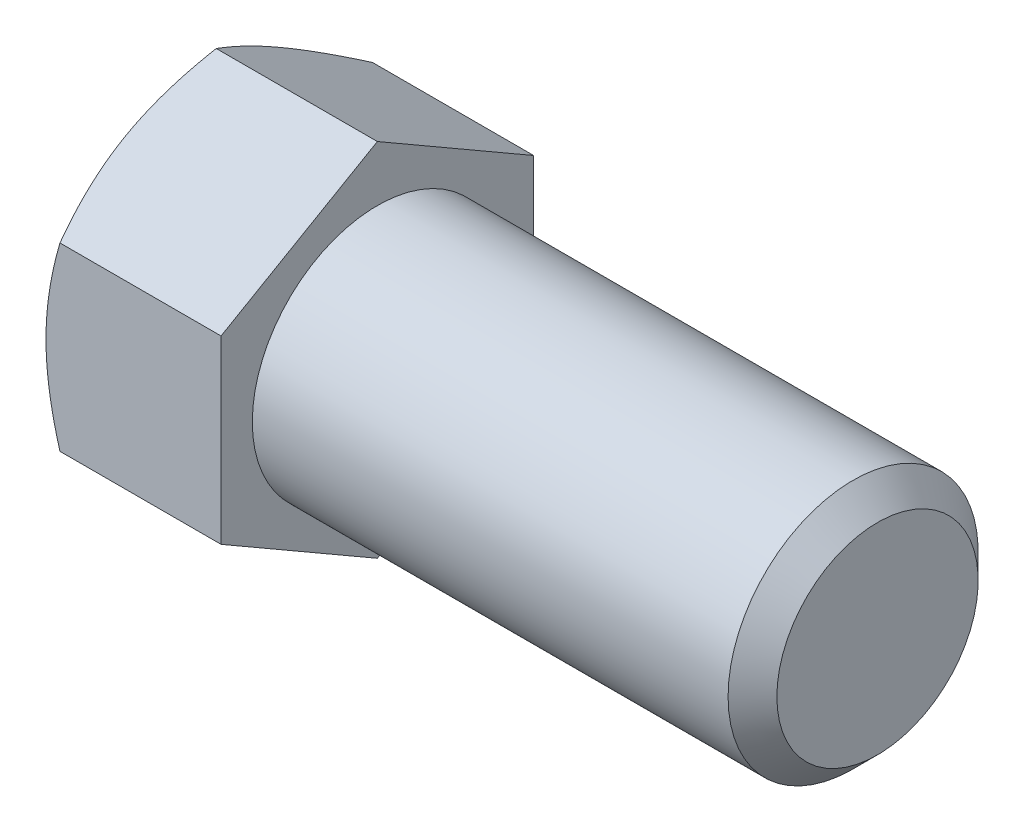
ISO-10303-21;
HEADER;
FILE_DESCRIPTION(('STEP AP214'),'2;1');
FILE_NAME('part.step','',(''),(''),'','','');
FILE_SCHEMA(('AUTOMOTIVE_DESIGN { 1 0 10303 214 1 1 1 1 }'));
ENDSEC;
DATA;
#1=APPLICATION_CONTEXT('core data for automotive mechanical design processes');
#2=APPLICATION_PROTOCOL_DEFINITION('international standard','automotive_design',2000,#1);
#3=PRODUCT_CONTEXT('',#1,'mechanical');
#4=PRODUCT('Part','Part','',(#3));
#5=PRODUCT_RELATED_PRODUCT_CATEGORY('part','',(#4));
#6=PRODUCT_DEFINITION_FORMATION('','',#4);
#7=PRODUCT_DEFINITION_CONTEXT('part definition',#1,'design');
#8=PRODUCT_DEFINITION('design','',#6,#7);
#9=PRODUCT_DEFINITION_SHAPE('','',#8);
#10=(LENGTH_UNIT() NAMED_UNIT(*) SI_UNIT(.MILLI.,.METRE.));
#11=(NAMED_UNIT(*) PLANE_ANGLE_UNIT() SI_UNIT($,.RADIAN.));
#12=(NAMED_UNIT(*) SI_UNIT($,.STERADIAN.) SOLID_ANGLE_UNIT());
#13=UNCERTAINTY_MEASURE_WITH_UNIT(LENGTH_MEASURE(1.E-05),#10,'distance_accuracy_value','');
#14=(GEOMETRIC_REPRESENTATION_CONTEXT(3) GLOBAL_UNCERTAINTY_ASSIGNED_CONTEXT((#13)) GLOBAL_UNIT_ASSIGNED_CONTEXT((#10,
#11,#12)) REPRESENTATION_CONTEXT('',''));
#15=CARTESIAN_POINT('',(0.,0.,0.));
#16=DIRECTION('',(0.,0.,1.));
#17=DIRECTION('',(1.,0.,0.));
#18=AXIS2_PLACEMENT_3D('',#15,#16,#17);
#19=CARTESIAN_POINT('',(2.8,1.44337567297406,-2.5));
#20=DIRECTION('',(0.,-0.866025403784438,0.500000000000001));
#21=DIRECTION('',(0.,-0.500000000000001,-0.866025403784438));
#22=AXIS2_PLACEMENT_3D('',#19,#20,#21);
#23=PLANE('',#22);
#24=CARTESIAN_POINT('',(0.223357664359109,2.88686681600197,0.0002));
#25=CARTESIAN_POINT('',(0.186721620107627,2.82343724785375,-0.109663234734871));
#26=CARTESIAN_POINT('',(0.153402218965057,2.75946016087834,-0.220474799896526));
#27=CARTESIAN_POINT('',(0.0952422855578583,2.63039810762178,-0.444016833466049));
#28=CARTESIAN_POINT('',(0.0704223291477388,2.5653108477275,-0.556751274528388));
#29=CARTESIAN_POINT('',(0.0317856514410523,2.43594298024479,-0.780822993875268));
#30=CARTESIAN_POINT('',(0.0177117961856391,2.37168227992023,-0.892125791767376));
#31=CARTESIAN_POINT('',(0.000909152352750157,2.24285844015415,-1.11525522746833));
#32=CARTESIAN_POINT('',(-0.00183354879637352,2.17829576909553,-1.22708105401423));
#33=CARTESIAN_POINT('',(0.0038657600080532,2.05765212479586,-1.43604197555152));
#34=CARTESIAN_POINT('',(0.0109083943818612,2.0015531110824,-1.53320831755773));
#35=CARTESIAN_POINT('',(0.0332314191249419,1.88972057631678,-1.726907949711));
#36=CARTESIAN_POINT('',(0.0485194384402664,1.8339874422038,-1.82344056965973));
#37=CARTESIAN_POINT('',(0.0867390938444195,1.7219242445005,-2.01753972174048));
#38=CARTESIAN_POINT('',(0.109832776125516,1.66560836761316,-2.11508168178214));
#39=CARTESIAN_POINT('',(0.162246656577912,1.55381665489446,-2.30871060807609));
#40=CARTESIAN_POINT('',(0.191554535624547,1.49833938633502,-2.40480005588618));
#41=CARTESIAN_POINT('',(0.223357664359107,1.44326020292022,-2.5002));
#42=B_SPLINE_CURVE_WITH_KNOTS('',3,(#24,#25,#26,#27,#28,#29,#30,#31,#32,#33,#34,#35,#36,#37,#38,
#39,#40,#41),.UNSPECIFIED.,.F.,.F.,(4,2,2,2,2,2,2,2,4),(0.,0.396285827362227,0.793524330152051,
1.18093086852114,1.56786160134475,1.90479741793733,2.24204551660463,2.58677531536756,
2.93082800105257),.UNSPECIFIED.);
#43=CARTESIAN_POINT('',(0.223290993692602,2.88675134594813,0.));
#44=VERTEX_POINT('',#43);
#45=CARTESIAN_POINT('',(0.,2.1650635094611,-1.25));
#46=VERTEX_POINT('',#45);
#47=EDGE_CURVE('E52',#44,#46,#42,.T.);
#48=ORIENTED_EDGE('',*,*,#47,.F.);
#49=DIRECTION('',(-1.,0.,0.));
#50=VECTOR('',#49,1.);
#51=CARTESIAN_POINT('',(2.8,2.88675134594813,0.));
#52=LINE('',#51,#50);
#53=CARTESIAN_POINT('',(2.8,2.88675134594813,0.));
#54=VERTEX_POINT('',#53);
#55=EDGE_CURVE('E148',#54,#44,#52,.T.);
#56=ORIENTED_EDGE('',*,*,#55,.F.);
#57=DIRECTION('',(0.,0.500000000000001,0.866025403784438));
#58=VECTOR('',#57,1.);
#59=CARTESIAN_POINT('',(2.8,1.44337567297406,-2.5));
#60=LINE('',#59,#58);
#61=CARTESIAN_POINT('',(2.8,1.44337567297406,-2.5));
#62=VERTEX_POINT('',#61);
#63=EDGE_CURVE('E233',#62,#54,#60,.T.);
#64=ORIENTED_EDGE('',*,*,#63,.F.);
#65=DIRECTION('',(-1.,0.,0.));
#66=VECTOR('',#65,1.);
#67=CARTESIAN_POINT('',(2.8,1.44337567297406,-2.5));
#68=LINE('',#67,#66);
#69=CARTESIAN_POINT('',(0.2232909936926,1.44337567297406,-2.5));
#70=VERTEX_POINT('',#69);
#71=EDGE_CURVE('E136',#62,#70,#68,.T.);
#72=ORIENTED_EDGE('',*,*,#71,.T.);
#73=EDGE_CURVE('E130',#46,#70,#42,.T.);
#74=ORIENTED_EDGE('',*,*,#73,.F.);
#75=EDGE_LOOP('',(#48,#56,#64,#72,#74));
#76=FACE_BOUND('',#75,.T.);
#77=ADVANCED_FACE('F36',(#76),#23,.F.);
#78=CARTESIAN_POINT('',(2.8,2.88675134594813,0.));
#79=DIRECTION('',(0.,-0.866025403784438,-0.500000000000001));
#80=DIRECTION('',(0.,0.500000000000001,-0.866025403784438));
#81=AXIS2_PLACEMENT_3D('',#78,#79,#80);
#82=PLANE('',#81);
#83=CARTESIAN_POINT('',(0.223357664359107,1.44326020292023,2.5002));
#84=CARTESIAN_POINT('',(0.186721620107625,1.50668977106845,2.39033676526513));
#85=CARTESIAN_POINT('',(0.153402218965055,1.57066685804385,2.27952520010348));
#86=CARTESIAN_POINT('',(0.0952422855578574,1.69972891130041,2.05598316653395));
#87=CARTESIAN_POINT('',(0.0704223291477381,1.7648161711947,1.94324872547161));
#88=CARTESIAN_POINT('',(0.0317856514410519,1.8941840386774,1.71917700612473));
#89=CARTESIAN_POINT('',(0.0177117961856388,1.95844473900197,1.60787420823262));
#90=CARTESIAN_POINT('',(0.000909152352750207,2.08726857876804,1.38474477253167));
#91=CARTESIAN_POINT('',(-0.00183354879637325,2.15183124982667,1.27291894598578));
#92=CARTESIAN_POINT('',(0.00386576000805368,2.27247489412634,1.06395802444848));
#93=CARTESIAN_POINT('',(0.0109083943818618,2.32857390783979,0.96679168244227));
#94=CARTESIAN_POINT('',(0.0332314191249426,2.44040644260542,0.773092050288999));
#95=CARTESIAN_POINT('',(0.0485194384402673,2.4961395767184,0.676559430340269));
#96=CARTESIAN_POINT('',(0.0867390938444206,2.60820277442169,0.482460278259525));
#97=CARTESIAN_POINT('',(0.109832776125517,2.66451865130903,0.38491831821786));
#98=CARTESIAN_POINT('',(0.162246656577913,2.77631036402774,0.191289391923915));
#99=CARTESIAN_POINT('',(0.191554535624549,2.83178763258718,0.0951999441138241));
#100=CARTESIAN_POINT('',(0.223357664359109,2.88686681600197,-0.000199999999999895));
#101=B_SPLINE_CURVE_WITH_KNOTS('',3,(#83,#84,#85,#86,#87,#88,#89,#90,#91,#92,#93,#94,#95,#96,
#97,#98,#99,#100),.UNSPECIFIED.,.F.,.F.,(4,2,2,2,2,2,2,2,4),(0.,0.396285827362227,
0.79352433015205,1.18093086852114,1.56786160134475,1.90479741793733,2.24204551660463,
2.58677531536756,2.93082800105257),.UNSPECIFIED.);
#102=CARTESIAN_POINT('',(0.223290993692601,1.44337567297406,2.5));
#103=VERTEX_POINT('',#102);
#104=CARTESIAN_POINT('',(0.,2.1650635094611,1.25));
#105=VERTEX_POINT('',#104);
#106=EDGE_CURVE('E59',#103,#105,#101,.T.);
#107=ORIENTED_EDGE('',*,*,#106,.F.);
#108=DIRECTION('',(-1.,0.,0.));
#109=VECTOR('',#108,1.);
#110=CARTESIAN_POINT('',(2.8,1.44337567297406,2.5));
#111=LINE('',#110,#109);
#112=CARTESIAN_POINT('',(2.8,1.44337567297406,2.5));
#113=VERTEX_POINT('',#112);
#114=EDGE_CURVE('E146',#113,#103,#111,.T.);
#115=ORIENTED_EDGE('',*,*,#114,.F.);
#116=DIRECTION('',(0.,-0.500000000000001,0.866025403784438));
#117=VECTOR('',#116,1.);
#118=CARTESIAN_POINT('',(2.8,2.88675134594813,0.));
#119=LINE('',#118,#117);
#120=EDGE_CURVE('E231',#54,#113,#119,.T.);
#121=ORIENTED_EDGE('',*,*,#120,.F.);
#122=ORIENTED_EDGE('',*,*,#55,.T.);
#123=EDGE_CURVE('E163',#105,#44,#101,.T.);
#124=ORIENTED_EDGE('',*,*,#123,.F.);
#125=EDGE_LOOP('',(#107,#115,#121,#122,#124));
#126=FACE_BOUND('',#125,.T.);
#127=ADVANCED_FACE('F169',(#126),#82,.F.);
#128=CARTESIAN_POINT('',(2.8,1.44337567297406,2.5));
#129=DIRECTION('',(0.,0.,-1.));
#130=DIRECTION('',(-1.,0.,0.));
#131=AXIS2_PLACEMENT_3D('',#128,#129,#130);
#132=PLANE('',#131);
#133=CARTESIAN_POINT('',(1.22855318885537,-3.89456178896055,2.5));
#134=CARTESIAN_POINT('',(1.17542694137505,-3.78518777690181,2.5));
#135=CARTESIAN_POINT('',(1.12280519591775,-3.67556448556095,2.5));
#136=CARTESIAN_POINT('',(1.01885422595005,-3.45568677714112,2.5));
#137=CARTESIAN_POINT('',(0.967525202059665,-3.34543226532082,2.5));
#138=CARTESIAN_POINT('',(0.866188886613414,-3.1236002559927,2.5));
#139=CARTESIAN_POINT('',(0.816190154917621,-3.01201883479594,2.5));
#140=CARTESIAN_POINT('',(0.718216687005142,-2.78797419680533,2.5));
#141=CARTESIAN_POINT('',(0.67024185613036,-2.6755110215436,2.5));
#142=CARTESIAN_POINT('',(0.575352359984653,-2.445899545328,2.5));
#143=CARTESIAN_POINT('',(0.528520993404683,-2.32871663328566,2.5));
#144=CARTESIAN_POINT('',(0.438360526965966,-2.09298652342405,2.5));
#145=CARTESIAN_POINT('',(0.395031817348535,-1.97443917526516,2.5));
#146=CARTESIAN_POINT('',(0.313000777682635,-1.7360075340814,2.5));
#147=CARTESIAN_POINT('',(0.274289250938236,-1.61612643691826,2.5));
#148=CARTESIAN_POINT('',(0.202722876126129,-1.3746450542109,2.5));
#149=CARTESIAN_POINT('',(0.169866203510862,-1.25304531704064,2.5));
#150=CARTESIAN_POINT('',(0.111741004448589,-1.00869920910633,2.5));
#151=CARTESIAN_POINT('',(0.0864328811174047,-0.885962433285647,2.5));
#152=CARTESIAN_POINT('',(0.0448362617216553,-0.638945112866592,2.5));
#153=CARTESIAN_POINT('',(0.0285468152101086,-0.514664732355297,2.5));
#154=CARTESIAN_POINT('',(0.00649930340867465,-0.266811068646013,2.5));
#155=CARTESIAN_POINT('',(0.000604461592925859,-0.143250259860454,2.5));
#156=CARTESIAN_POINT('',(-0.000515211510331114,0.103932580030403,2.5));
#157=CARTESIAN_POINT('',(0.00426030688877021,0.227554613009386,2.5));
#158=CARTESIAN_POINT('',(0.0210391705607746,0.436852877848504,2.5));
#159=CARTESIAN_POINT('',(0.0304344892214288,0.52275129590089,2.5));
#160=CARTESIAN_POINT('',(0.0538020617827595,0.693927482741467,2.5));
#161=CARTESIAN_POINT('',(0.0677749189109921,0.77920516821473,2.5));
#162=CARTESIAN_POINT('',(0.115826026564337,1.03398354477519,2.5));
#163=CARTESIAN_POINT('',(0.156028895622202,1.20234244088764,2.5));
#164=CARTESIAN_POINT('',(0.225872865312831,1.45422599559625,2.5));
#165=CARTESIAN_POINT('',(0.251092182848532,1.53905096192716,2.5));
#166=CARTESIAN_POINT('',(0.304178061834171,1.70787649202533,2.5));
#167=CARTESIAN_POINT('',(0.332044644195233,1.79187704927468,2.5));
#168=CARTESIAN_POINT('',(0.389975404122806,1.95908189104776,2.5));
#169=CARTESIAN_POINT('',(0.420038924174978,2.04228640545386,2.5));
#170=CARTESIAN_POINT('',(0.482006977415588,2.20800226121571,2.5));
#171=CARTESIAN_POINT('',(0.513911461935726,2.29051362082991,2.5));
#172=CARTESIAN_POINT('',(0.606279983232752,2.5229301514384,2.5));
#173=CARTESIAN_POINT('',(0.668536826392883,2.67212228262777,2.5));
#174=CARTESIAN_POINT('',(0.79676883384387,2.96890604119182,2.5));
#175=CARTESIAN_POINT('',(0.862744467865462,3.11649746355636,2.5));
#176=CARTESIAN_POINT('',(0.99747857071366,3.41046947552171,2.5));
#177=CARTESIAN_POINT('',(1.06623810747421,3.55684957400946,2.5));
#178=CARTESIAN_POINT('',(1.205849009322,3.84861076633276,2.5));
#179=CARTESIAN_POINT('',(1.27670044155297,3.99399182791714,2.5));
#180=CARTESIAN_POINT('',(1.49187968010813,4.42943787581977,2.5));
#181=CARTESIAN_POINT('',(1.63860404765351,4.7183168149502,2.5));
#182=CARTESIAN_POINT('',(1.93595584132597,5.29395708830746,2.5));
#183=CARTESIAN_POINT('',(2.08658234574323,5.58071890241571,2.5));
#184=CARTESIAN_POINT('',(2.37325325724286,6.12044298023703,2.5));
#185=CARTESIAN_POINT('',(2.50901687566578,6.37355461680383,2.5));
#186=CARTESIAN_POINT('',(2.78204519932439,6.87898842373946,2.5));
#187=CARTESIAN_POINT('',(2.91931000833516,7.1313105379592,2.5));
#188=CARTESIAN_POINT('',(3.19446727280713,7.63447920125009,2.5));
#189=CARTESIAN_POINT('',(3.33235591850617,7.88532783596197,2.5));
#190=CARTESIAN_POINT('',(3.60897306921081,8.38653404775901,2.5));
#191=CARTESIAN_POINT('',(3.74770150202893,8.63689166466943,2.5));
#192=CARTESIAN_POINT('',(3.88673326778259,8.88707960811665,2.5));
#193=B_SPLINE_CURVE_WITH_KNOTS('',3,(#133,#134,#135,#136,#137,#138,#139,#140,#141,#142,#143,
#144,#145,#146,#147,#148,#149,#150,#151,#152,#153,#154,#155,#156,#157,#158,#159,#160,#161,#162,
#163,#164,#165,#166,#167,#168,#169,#170,#171,#172,#173,#174,#175,#176,#177,#178,#179,#180,#181,
#182,#183,#184,#185,#186,#187,#188,#189,#190,#191,#192),.UNSPECIFIED.,.F.,.F.,(4,2,2,2,2,2,2,2,
2,2,2,2,2,2,2,2,2,2,2,2,2,2,2,2,2,2,2,2,2,4),(0.,0.364786032318238,0.7296283319469,
1.09642632515231,1.46320714410722,1.84174688152727,2.22032873521446,2.59814345437173,
2.97584022847687,3.3515194175466,3.72715900755344,4.09781781948603,4.46848877874277,
4.72759570515995,4.98673679040598,5.50528019141929,5.77074088975374,6.03620368517489,
6.30158735394371,6.56696401016004,7.05186788050717,7.53683313825768,8.02198622987861,
8.50715491045693,9.47911071361778,10.4508389910069,11.312502054096,12.1742250639954,
13.0329693393653,13.8916408172524),.UNSPECIFIED.);
#194=CARTESIAN_POINT('',(0.223290993692601,-1.44337567297407,2.5));
#195=VERTEX_POINT('',#194);
#196=CARTESIAN_POINT('',(0.,0.,2.5));
#197=VERTEX_POINT('',#196);
#198=EDGE_CURVE('E243',#195,#197,#193,.T.);
#199=ORIENTED_EDGE('',*,*,#198,.F.);
#200=DIRECTION('',(-1.,0.,0.));
#201=VECTOR('',#200,1.);
#202=CARTESIAN_POINT('',(2.8,-1.44337567297407,2.5));
#203=LINE('',#202,#201);
#204=CARTESIAN_POINT('',(2.8,-1.44337567297407,2.5));
#205=VERTEX_POINT('',#204);
#206=EDGE_CURVE('E138',#205,#195,#203,.T.);
#207=ORIENTED_EDGE('',*,*,#206,.F.);
#208=DIRECTION('',(0.,-1.,0.));
#209=VECTOR('',#208,1.);
#210=CARTESIAN_POINT('',(2.8,1.44337567297406,2.5));
#211=LINE('',#210,#209);
#212=EDGE_CURVE('E227',#113,#205,#211,.T.);
#213=ORIENTED_EDGE('',*,*,#212,.F.);
#214=ORIENTED_EDGE('',*,*,#114,.T.);
#215=EDGE_CURVE('E185',#197,#103,#193,.T.);
#216=ORIENTED_EDGE('',*,*,#215,.F.);
#217=EDGE_LOOP('',(#199,#207,#213,#214,#216));
#218=FACE_BOUND('',#217,.T.);
#219=ADVANCED_FACE('F249',(#218),#132,.F.);
#220=CARTESIAN_POINT('',(2.8,-2.88675134594813,0.));
#221=DIRECTION('',(0.,0.866025403784438,-0.500000000000001));
#222=DIRECTION('',(0.,0.500000000000001,0.866025403784438));
#223=AXIS2_PLACEMENT_3D('',#220,#221,#222);
#224=PLANE('',#223);
#225=CARTESIAN_POINT('',(0.223357664359111,-2.88686681600197,-0.000200000000000148));
#226=CARTESIAN_POINT('',(0.186721620107628,-2.82343724785375,0.109663234734871));
#227=CARTESIAN_POINT('',(0.153402218965059,-2.75946016087835,0.220474799896526));
#228=CARTESIAN_POINT('',(0.0952422855578602,-2.63039810762178,0.44401683346605));
#229=CARTESIAN_POINT('',(0.0704223291477406,-2.5653108477275,0.556751274528389));
#230=CARTESIAN_POINT('',(0.0317856514410541,-2.4359429802448,0.780822993875269));
#231=CARTESIAN_POINT('',(0.0177117961856409,-2.37168227992023,0.892125791767377));
#232=CARTESIAN_POINT('',(0.000909152352752063,-2.24285844015415,1.11525522746833));
#233=CARTESIAN_POINT('',(-0.00183354879637156,-2.17829576909553,1.22708105401423));
#234=CARTESIAN_POINT('',(0.00386576000805524,-2.05765212479586,1.43604197555152));
#235=CARTESIAN_POINT('',(0.0109083943818633,-2.0015531110824,1.53320831755773));
#236=CARTESIAN_POINT('',(0.0332314191249437,-1.88972057631678,1.726907949711));
#237=CARTESIAN_POINT('',(0.048519438440268,-1.8339874422038,1.82344056965973));
#238=CARTESIAN_POINT('',(0.0867390938444209,-1.7219242445005,2.01753972174048));
#239=CARTESIAN_POINT('',(0.109832776125518,-1.66560836761317,2.11508168178214));
#240=CARTESIAN_POINT('',(0.162246656577914,-1.55381665489446,2.30871060807609));
#241=CARTESIAN_POINT('',(0.191554535624549,-1.49833938633502,2.40480005588618));
#242=CARTESIAN_POINT('',(0.223357664359108,-1.44326020292023,2.5002));
#243=B_SPLINE_CURVE_WITH_KNOTS('',3,(#225,#226,#227,#228,#229,#230,#231,#232,#233,#234,#235,
#236,#237,#238,#239,#240,#241,#242),.UNSPECIFIED.,.F.,.F.,(4,2,2,2,2,2,2,2,4),(0.,
0.396285827362228,0.793524330152052,1.18093086852114,1.56786160134476,1.90479741793733,
2.24204551660463,2.58677531536756,2.93082800105257),.UNSPECIFIED.);
#244=CARTESIAN_POINT('',(0.223290993692604,-2.88675134594813,0.));
#245=VERTEX_POINT('',#244);
#246=CARTESIAN_POINT('',(0.,-2.1650635094611,1.25));
#247=VERTEX_POINT('',#246);
#248=EDGE_CURVE('E171',#245,#247,#243,.T.);
#249=ORIENTED_EDGE('',*,*,#248,.F.);
#250=DIRECTION('',(-1.,0.,0.));
#251=VECTOR('',#250,1.);
#252=CARTESIAN_POINT('',(2.8,-2.88675134594813,0.));
#253=LINE('',#252,#251);
#254=CARTESIAN_POINT('',(2.8,-2.88675134594813,0.));
#255=VERTEX_POINT('',#254);
#256=EDGE_CURVE('E135',#255,#245,#253,.T.);
#257=ORIENTED_EDGE('',*,*,#256,.F.);
#258=DIRECTION('',(0.,-0.500000000000001,-0.866025403784438));
#259=VECTOR('',#258,1.);
#260=CARTESIAN_POINT('',(2.8,-2.88675134594813,0.));
#261=LINE('',#260,#259);
#262=EDGE_CURVE('E225',#205,#255,#261,.T.);
#263=ORIENTED_EDGE('',*,*,#262,.F.);
#264=ORIENTED_EDGE('',*,*,#206,.T.);
#265=EDGE_CURVE('E173',#247,#195,#243,.T.);
#266=ORIENTED_EDGE('',*,*,#265,.F.);
#267=EDGE_LOOP('',(#249,#257,#263,#264,#266));
#268=FACE_BOUND('',#267,.T.);
#269=ADVANCED_FACE('F221',(#268),#224,.F.);
#270=CARTESIAN_POINT('',(2.8,-1.44337567297407,-2.5));
#271=DIRECTION('',(0.,0.866025403784438,0.500000000000001));
#272=DIRECTION('',(0.,-0.500000000000001,0.866025403784438));
#273=AXIS2_PLACEMENT_3D('',#270,#271,#272);
#274=PLANE('',#273);
#275=CARTESIAN_POINT('',(0.223357664359109,-1.44326020292023,-2.5002));
#276=CARTESIAN_POINT('',(0.186721620107626,-1.50668977106845,-2.39033676526513));
#277=CARTESIAN_POINT('',(0.153402218965057,-1.57066685804386,-2.27952520010348));
#278=CARTESIAN_POINT('',(0.0952422855578589,-1.69972891130042,-2.05598316653395));
#279=CARTESIAN_POINT('',(0.0704223291477395,-1.7648161711947,-1.94324872547161));
#280=CARTESIAN_POINT('',(0.0317856514410535,-1.8941840386774,-1.71917700612473));
#281=CARTESIAN_POINT('',(0.0177117961856404,-1.95844473900197,-1.60787420823262));
#282=CARTESIAN_POINT('',(0.000909152352752036,-2.08726857876805,-1.38474477253167));
#283=CARTESIAN_POINT('',(-0.00183354879637132,-2.15183124982667,-1.27291894598577));
#284=CARTESIAN_POINT('',(0.00386576000805573,-2.27247489412634,-1.06395802444848));
#285=CARTESIAN_POINT('',(0.0109083943818638,-2.3285739078398,-0.966791682442269));
#286=CARTESIAN_POINT('',(0.0332314191249447,-2.44040644260542,-0.773092050288998));
#287=CARTESIAN_POINT('',(0.0485194384402695,-2.4961395767184,-0.676559430340268));
#288=CARTESIAN_POINT('',(0.0867390938444228,-2.6082027744217,-0.482460278259524));
#289=CARTESIAN_POINT('',(0.109832776125519,-2.66451865130903,-0.38491831821786));
#290=CARTESIAN_POINT('',(0.162246656577915,-2.77631036402774,-0.191289391923915));
#291=CARTESIAN_POINT('',(0.191554535624551,-2.83178763258718,-0.0951999441138239));
#292=CARTESIAN_POINT('',(0.223357664359111,-2.88686681600197,0.00019999999999985));
#293=B_SPLINE_CURVE_WITH_KNOTS('',3,(#275,#276,#277,#278,#279,#280,#281,#282,#283,#284,#285,
#286,#287,#288,#289,#290,#291,#292),.UNSPECIFIED.,.F.,.F.,(4,2,2,2,2,2,2,2,4),(0.,
0.396285827362227,0.793524330152051,1.18093086852114,1.56786160134475,1.90479741793733,
2.24204551660463,2.58677531536756,2.93082800105257),.UNSPECIFIED.);
#294=CARTESIAN_POINT('',(0.223290993692415,-1.44337567297435,-2.5));
#295=VERTEX_POINT('',#294);
#296=CARTESIAN_POINT('',(0.,-2.1650635094611,-1.25));
#297=VERTEX_POINT('',#296);
#298=EDGE_CURVE('E112',#295,#297,#293,.T.);
#299=ORIENTED_EDGE('',*,*,#298,.F.);
#300=DIRECTION('',(-1.,0.,0.));
#301=VECTOR('',#300,1.);
#302=CARTESIAN_POINT('',(2.8,-1.44337567297407,-2.5));
#303=LINE('',#302,#301);
#304=CARTESIAN_POINT('',(2.8,-1.44337567297407,-2.5));
#305=VERTEX_POINT('',#304);
#306=EDGE_CURVE('E126',#305,#295,#303,.T.);
#307=ORIENTED_EDGE('',*,*,#306,.F.);
#308=DIRECTION('',(0.,0.500000000000001,-0.866025403784438));
#309=VECTOR('',#308,1.);
#310=CARTESIAN_POINT('',(2.8,-1.44337567297407,-2.5));
#311=LINE('',#310,#309);
#312=EDGE_CURVE('E223',#255,#305,#311,.T.);
#313=ORIENTED_EDGE('',*,*,#312,.F.);
#314=ORIENTED_EDGE('',*,*,#256,.T.);
#315=EDGE_CURVE('E129',#297,#245,#293,.T.);
#316=ORIENTED_EDGE('',*,*,#315,.F.);
#317=EDGE_LOOP('',(#299,#307,#313,#314,#316));
#318=FACE_BOUND('',#317,.T.);
#319=ADVANCED_FACE('F124',(#318),#274,.F.);
#320=CARTESIAN_POINT('',(2.8,1.44337567297406,-2.5));
#321=DIRECTION('',(0.,0.,1.));
#322=DIRECTION('',(0.,-1.,0.));
#323=AXIS2_PLACEMENT_3D('',#320,#321,#322);
#324=PLANE('',#323);
#325=CARTESIAN_POINT('',(1.22855318899822,-3.89456178925455,-2.5));
#326=CARTESIAN_POINT('',(1.17542694151192,-3.78518777718592,-2.5));
#327=CARTESIAN_POINT('',(1.12280519604865,-3.67556448583515,-2.5));
#328=CARTESIAN_POINT('',(1.01885422606902,-3.45568677739549,-2.5));
#329=CARTESIAN_POINT('',(0.967525202172698,-3.34543226556525,-2.5));
#330=CARTESIAN_POINT('',(0.866188886714554,-3.12360025621711,-2.5));
#331=CARTESIAN_POINT('',(0.816190155012813,-3.01201883501026,-2.5));
#332=CARTESIAN_POINT('',(0.718216687088538,-2.7879741969994,-2.5));
#333=CARTESIAN_POINT('',(0.670241856207908,-2.67551102172752,-2.5));
#334=CARTESIAN_POINT('',(0.575352360050362,-2.44589954549086,-2.5));
#335=CARTESIAN_POINT('',(0.528520993464413,-2.32871663343761,-2.5));
#336=CARTESIAN_POINT('',(0.43836052701406,-2.09298652355402,-2.5));
#337=CARTESIAN_POINT('',(0.395031817390973,-1.97443917538405,-2.5));
#338=CARTESIAN_POINT('',(0.313000777714306,-1.73600753417791,-2.5));
#339=CARTESIAN_POINT('',(0.274289250964794,-1.61612643700348,-2.5));
#340=CARTESIAN_POINT('',(0.202722876143305,-1.37464505427324,-2.5));
#341=CARTESIAN_POINT('',(0.169866203523767,-1.25304531709138,-2.5));
#342=CARTESIAN_POINT('',(0.111741004452882,-1.00869920912786,-2.5));
#343=CARTESIAN_POINT('',(0.0864328811176957,-0.885962433289478,-2.5));
#344=CARTESIAN_POINT('',(0.0448362617166218,-0.638945112834602,-2.5));
#345=CARTESIAN_POINT('',(0.0285468152037509,-0.514664732305188,-2.5));
#346=CARTESIAN_POINT('',(0.00649930340289287,-0.266811068559963,-2.5));
#347=CARTESIAN_POINT('',(0.000604461588985759,-0.143250259756585,-2.5));
#348=CARTESIAN_POINT('',(-0.000515211507495206,0.103932580169628,-2.5));
#349=CARTESIAN_POINT('',(0.00426030689654131,0.227554613166149,-2.5));
#350=CARTESIAN_POINT('',(0.021039170578481,0.436852878027384,-2.5));
#351=CARTESIAN_POINT('',(0.0304344892430831,0.522751296084547,-2.5));
#352=CARTESIAN_POINT('',(0.0538020618125206,0.693927482934466,-2.5));
#353=CARTESIAN_POINT('',(0.0677749189449122,0.779205168412295,-2.5));
#354=CARTESIAN_POINT('',(0.115826026610823,1.03398354498621,-2.5));
#355=CARTESIAN_POINT('',(0.15602889567718,1.20234244110729,-2.5));
#356=CARTESIAN_POINT('',(0.225872865380349,1.45422599582881,-2.5));
#357=CARTESIAN_POINT('',(0.251092182920263,1.53905096216411,-2.5));
#358=CARTESIAN_POINT('',(0.304178061914199,1.70787649227102,-2.5));
#359=CARTESIAN_POINT('',(0.332044644279349,1.79187704952471,-2.5));
#360=CARTESIAN_POINT('',(0.389975404214952,1.95908189130646,-2.5));
#361=CARTESIAN_POINT('',(0.420038924271067,2.04228640571688,-2.5));
#362=CARTESIAN_POINT('',(0.482006977519431,2.20800226148736,-2.5));
#363=CARTESIAN_POINT('',(0.51391146204338,2.29051362110588,-2.5));
#364=CARTESIAN_POINT('',(0.606279983347057,2.52293015171666,-2.5));
#365=CARTESIAN_POINT('',(0.668536826509548,2.67212228290415,-2.5));
#366=CARTESIAN_POINT('',(0.79676883396451,2.96890604146469,-2.5));
#367=CARTESIAN_POINT('',(0.862744467987717,3.11649746382759,-2.5));
#368=CARTESIAN_POINT('',(0.997478570838619,3.41046947578987,-2.5));
#369=CARTESIAN_POINT('',(1.06623810760025,3.55684957427615,-2.5));
#370=CARTESIAN_POINT('',(1.20584900944986,3.8486107665967,-2.5));
#371=CARTESIAN_POINT('',(1.27670044168155,3.99399182817978,-2.5));
#372=CARTESIAN_POINT('',(1.49187968023841,4.4294378760785,-2.5));
#373=CARTESIAN_POINT('',(1.6386040477844,4.7183168152065,-2.5));
#374=CARTESIAN_POINT('',(1.9359558414575,5.2939570885592,-2.5));
#375=CARTESIAN_POINT('',(2.08658234587482,5.58071890266531,-2.5));
#376=CARTESIAN_POINT('',(2.37325325737529,6.12044298048473,-2.5));
#377=CARTESIAN_POINT('',(2.50901687579906,6.37355461705173,-2.5));
#378=CARTESIAN_POINT('',(2.7820451994592,6.87898842398783,-2.5));
#379=CARTESIAN_POINT('',(2.91931000847065,7.13131053820785,-2.5));
#380=CARTESIAN_POINT('',(3.19446727294406,7.63447920149962,-2.5));
#381=CARTESIAN_POINT('',(3.33235591864385,7.88532783621211,-2.5));
#382=CARTESIAN_POINT('',(3.60897306934993,8.38653404801041,-2.5));
#383=CARTESIAN_POINT('',(3.74770150216873,8.6368916649215,-2.5));
#384=CARTESIAN_POINT('',(3.88673326792305,8.88707960836938,-2.5));
#385=B_SPLINE_CURVE_WITH_KNOTS('',3,(#325,#326,#327,#328,#329,#330,#331,#332,#333,#334,#335,
#336,#337,#338,#339,#340,#341,#342,#343,#344,#345,#346,#347,#348,#349,#350,#351,#352,#353,#354,
#355,#356,#357,#358,#359,#360,#361,#362,#363,#364,#365,#366,#367,#368,#369,#370,#371,#372,#373,
#374,#375,#376,#377,#378,#379,#380,#381,#382,#383,#384),.UNSPECIFIED.,.F.,.F.,(4,2,2,2,2,2,2,2,
2,2,2,2,2,2,2,2,2,2,2,2,2,2,2,2,2,2,2,2,2,4),(0.,0.364786032352776,0.729628332015982,
1.09642632525631,1.46320714424614,1.84174688170322,2.22032873542745,2.59814345462164,
2.97584022876367,3.35151941788771,3.72715900794878,4.0978178199343,4.468488779244,
4.7275957056767,4.98673679093826,5.5052801919827,5.7707408903334,6.03620368577079,
6.30158735455582,6.56696401078836,7.05186788113304,7.53683313888106,8.02198623049944,
8.5071549110752,9.47911071423037,10.4508389916139,11.3125020547047,12.1742250646059,
13.0329693399785,13.8916408178683),.UNSPECIFIED.);
#386=CARTESIAN_POINT('',(0.,0.,-2.5));
#387=VERTEX_POINT('',#386);
#388=EDGE_CURVE('E118',#70,#387,#385,.F.);
#389=ORIENTED_EDGE('',*,*,#388,.F.);
#390=ORIENTED_EDGE('',*,*,#71,.F.);
#391=DIRECTION('',(0.,1.,0.));
#392=VECTOR('',#391,1.);
#393=CARTESIAN_POINT('',(2.8,1.44337567297406,-2.5));
#394=LINE('',#393,#392);
#395=EDGE_CURVE('E134',#305,#62,#394,.T.);
#396=ORIENTED_EDGE('',*,*,#395,.F.);
#397=ORIENTED_EDGE('',*,*,#306,.T.);
#398=EDGE_CURVE('E109',#387,#295,#385,.F.);
#399=ORIENTED_EDGE('',*,*,#398,.F.);
#400=EDGE_LOOP('',(#389,#390,#396,#397,#399));
#401=FACE_BOUND('',#400,.T.);
#402=ADVANCED_FACE('F132',(#401),#324,.F.);
#403=CARTESIAN_POINT('',(2.8,2.88675134594813,0.));
#404=DIRECTION('',(1.,0.,0.));
#405=DIRECTION('',(0.,0.,-1.));
#406=AXIS2_PLACEMENT_3D('',#403,#404,#405);
#407=PLANE('',#406);
#408=CARTESIAN_POINT('',(2.8,0.,0.));
#409=DIRECTION('',(1.,0.,0.));
#410=DIRECTION('',(0.,0.,-1.));
#411=AXIS2_PLACEMENT_3D('',#408,#409,#410);
#412=CIRCLE('',#411,2.);
#413=CARTESIAN_POINT('',(2.8,0.,-2.));
#414=VERTEX_POINT('',#413);
#415=EDGE_CURVE('E236',#414,#414,#412,.F.);
#416=ORIENTED_EDGE('',*,*,#415,.T.);
#417=EDGE_LOOP('',(#416));
#418=FACE_BOUND('',#417,.T.);
#419=ORIENTED_EDGE('',*,*,#63,.T.);
#420=ORIENTED_EDGE('',*,*,#120,.T.);
#421=ORIENTED_EDGE('',*,*,#212,.T.);
#422=ORIENTED_EDGE('',*,*,#262,.T.);
#423=ORIENTED_EDGE('',*,*,#312,.T.);
#424=ORIENTED_EDGE('',*,*,#395,.T.);
#425=EDGE_LOOP('',(#419,#420,#421,#422,#423,#424));
#426=FACE_BOUND('',#425,.T.);
#427=ADVANCED_FACE('F251',(#418,#426),#407,.T.);
#428=CARTESIAN_POINT('',(0.,0.,0.));
#429=DIRECTION('',(-1.,0.,0.));
#430=DIRECTION('',(0.,0.,1.));
#431=AXIS2_PLACEMENT_3D('',#428,#429,#430);
#432=CYLINDRICAL_SURFACE('',#431,2.);
#433=ORIENTED_EDGE('',*,*,#415,.F.);
#434=EDGE_LOOP('',(#433));
#435=FACE_BOUND('',#434,.T.);
#436=CARTESIAN_POINT('',(10.41,0.,0.));
#437=DIRECTION('',(-1.,0.,0.));
#438=DIRECTION('',(0.,0.,1.));
#439=AXIS2_PLACEMENT_3D('',#436,#437,#438);
#440=CIRCLE('',#439,2.);
#441=CARTESIAN_POINT('',(10.41,0.,2.));
#442=VERTEX_POINT('',#441);
#443=EDGE_CURVE('E239',#442,#442,#440,.T.);
#444=ORIENTED_EDGE('',*,*,#443,.T.);
#445=EDGE_LOOP('',(#444));
#446=FACE_BOUND('',#445,.T.);
#447=ADVANCED_FACE('F282',(#435,#446),#432,.T.);
#448=CARTESIAN_POINT('',(10.8,0.,0.));
#449=DIRECTION('',(-1.,0.,0.));
#450=DIRECTION('',(0.,0.,1.));
#451=AXIS2_PLACEMENT_3D('',#448,#449,#450);
#452=CONICAL_SURFACE('',#451,1.61,0.785398163397442);
#453=ORIENTED_EDGE('',*,*,#443,.F.);
#454=EDGE_LOOP('',(#453));
#455=FACE_BOUND('',#454,.T.);
#456=CARTESIAN_POINT('',(10.8,0.,0.));
#457=DIRECTION('',(-1.,0.,0.));
#458=DIRECTION('',(0.,0.,1.));
#459=AXIS2_PLACEMENT_3D('',#456,#457,#458);
#460=CIRCLE('',#459,1.61);
#461=CARTESIAN_POINT('',(10.8,0.,1.61));
#462=VERTEX_POINT('',#461);
#463=EDGE_CURVE('E241',#462,#462,#460,.T.);
#464=ORIENTED_EDGE('',*,*,#463,.T.);
#465=EDGE_LOOP('',(#464));
#466=FACE_BOUND('',#465,.T.);
#467=ADVANCED_FACE('F285',(#455,#466),#452,.T.);
#468=CARTESIAN_POINT('',(10.8,0.,0.));
#469=DIRECTION('',(-1.,0.,0.));
#470=DIRECTION('',(0.,0.,1.));
#471=AXIS2_PLACEMENT_3D('',#468,#469,#470);
#472=PLANE('',#471);
#473=ORIENTED_EDGE('',*,*,#463,.F.);
#474=EDGE_LOOP('',(#473));
#475=FACE_BOUND('',#474,.T.);
#476=ADVANCED_FACE('F198',(#475),#472,.F.);
#477=CARTESIAN_POINT('',(0.,0.,0.));
#478=DIRECTION('',(1.,0.,0.));
#479=DIRECTION('',(0.,0.,-1.));
#480=AXIS2_PLACEMENT_3D('',#477,#478,#479);
#481=CONICAL_SURFACE('',#480,2.5,1.0471975511966);
#482=ORIENTED_EDGE('',*,*,#298,.T.);
#483=CARTESIAN_POINT('',(0.,0.,0.));
#484=DIRECTION('',(1.,0.,0.));
#485=DIRECTION('',(0.,0.,-1.));
#486=AXIS2_PLACEMENT_3D('',#483,#484,#485);
#487=CIRCLE('',#486,2.5);
#488=EDGE_CURVE('E40',#297,#387,#487,.T.);
#489=ORIENTED_EDGE('',*,*,#488,.T.);
#490=ORIENTED_EDGE('',*,*,#398,.T.);
#491=EDGE_LOOP('',(#482,#489,#490));
#492=FACE_BOUND('',#491,.T.);
#493=ADVANCED_FACE('F111',(#492),#481,.T.);
#494=ORIENTED_EDGE('',*,*,#248,.T.);
#495=EDGE_CURVE('E153',#247,#297,#487,.T.);
#496=ORIENTED_EDGE('',*,*,#495,.T.);
#497=ORIENTED_EDGE('',*,*,#315,.T.);
#498=EDGE_LOOP('',(#494,#496,#497));
#499=FACE_BOUND('',#498,.T.);
#500=ADVANCED_FACE('F197',(#499),#481,.T.);
#501=ORIENTED_EDGE('',*,*,#198,.T.);
#502=EDGE_CURVE('E154',#197,#247,#487,.T.);
#503=ORIENTED_EDGE('',*,*,#502,.T.);
#504=ORIENTED_EDGE('',*,*,#265,.T.);
#505=EDGE_LOOP('',(#501,#503,#504));
#506=FACE_BOUND('',#505,.T.);
#507=ADVANCED_FACE('F192',(#506),#481,.T.);
#508=ORIENTED_EDGE('',*,*,#215,.T.);
#509=ORIENTED_EDGE('',*,*,#106,.T.);
#510=CARTESIAN_POINT('',(0.,0.,0.));
#511=DIRECTION('',(-1.,0.,0.));
#512=DIRECTION('',(0.,0.,1.));
#513=AXIS2_PLACEMENT_3D('',#510,#511,#512);
#514=CIRCLE('',#513,2.5);
#515=EDGE_CURVE('E119',#197,#105,#514,.T.);
#516=ORIENTED_EDGE('',*,*,#515,.F.);
#517=EDGE_LOOP('',(#508,#509,#516));
#518=FACE_BOUND('',#517,.T.);
#519=ADVANCED_FACE('F196',(#518),#481,.T.);
#520=ORIENTED_EDGE('',*,*,#123,.T.);
#521=ORIENTED_EDGE('',*,*,#47,.T.);
#522=EDGE_CURVE('E45',#46,#105,#487,.T.);
#523=ORIENTED_EDGE('',*,*,#522,.T.);
#524=EDGE_LOOP('',(#520,#521,#523));
#525=FACE_BOUND('',#524,.T.);
#526=ADVANCED_FACE('F162',(#525),#481,.T.);
#527=ORIENTED_EDGE('',*,*,#73,.T.);
#528=ORIENTED_EDGE('',*,*,#388,.T.);
#529=EDGE_CURVE('E11',#387,#46,#487,.T.);
#530=ORIENTED_EDGE('',*,*,#529,.T.);
#531=EDGE_LOOP('',(#527,#528,#530));
#532=FACE_BOUND('',#531,.T.);
#533=ADVANCED_FACE('F254',(#532),#481,.T.);
#534=CARTESIAN_POINT('',(0.,2.88675134594813,0.));
#535=DIRECTION('',(1.,0.,0.));
#536=DIRECTION('',(0.,0.,-1.));
#537=AXIS2_PLACEMENT_3D('',#534,#535,#536);
#538=PLANE('',#537);
#539=ORIENTED_EDGE('',*,*,#529,.F.);
#540=ORIENTED_EDGE('',*,*,#488,.F.);
#541=ORIENTED_EDGE('',*,*,#495,.F.);
#542=ORIENTED_EDGE('',*,*,#502,.F.);
#543=ORIENTED_EDGE('',*,*,#515,.T.);
#544=ORIENTED_EDGE('',*,*,#522,.F.);
#545=EDGE_LOOP('',(#539,#540,#541,#542,#543,#544));
#546=FACE_BOUND('',#545,.T.);
#547=ADVANCED_FACE('F166',(#546),#538,.F.);
#548=CLOSED_SHELL('',(#77,#127,#219,#269,#319,#402,#427,#447,#467,#476,#493,#500,#507,#519,#526,
#533,#547));
#549=MANIFOLD_SOLID_BREP('B2',#548);
#550=ADVANCED_BREP_SHAPE_REPRESENTATION('',(#18,#549),#14);
#551=SHAPE_DEFINITION_REPRESENTATION(#9,#550);
ENDSEC;
END-ISO-10303-21;
